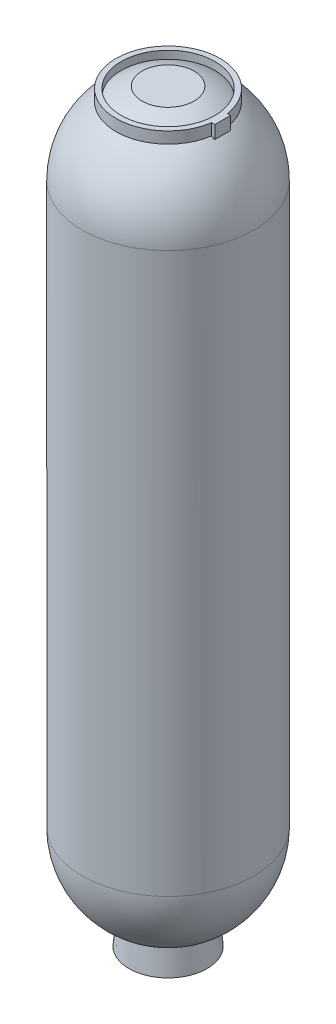
ISO-10303-21;
HEADER;
FILE_DESCRIPTION(('STEP AP214'),'2;1');
FILE_NAME('part.step','',(''),(''),'','','');
FILE_SCHEMA(('AUTOMOTIVE_DESIGN { 1 0 10303 214 1 1 1 1 }'));
ENDSEC;
DATA;
#1=APPLICATION_CONTEXT('core data for automotive mechanical design processes');
#2=APPLICATION_PROTOCOL_DEFINITION('international standard','automotive_design',2000,#1);
#3=PRODUCT_CONTEXT('',#1,'mechanical');
#4=PRODUCT('Part','Part','',(#3));
#5=PRODUCT_RELATED_PRODUCT_CATEGORY('part','',(#4));
#6=PRODUCT_DEFINITION_FORMATION('','',#4);
#7=PRODUCT_DEFINITION_CONTEXT('part definition',#1,'design');
#8=PRODUCT_DEFINITION('design','',#6,#7);
#9=PRODUCT_DEFINITION_SHAPE('','',#8);
#10=(LENGTH_UNIT() NAMED_UNIT(*) SI_UNIT(.MILLI.,.METRE.));
#11=(NAMED_UNIT(*) PLANE_ANGLE_UNIT() SI_UNIT($,.RADIAN.));
#12=(NAMED_UNIT(*) SI_UNIT($,.STERADIAN.) SOLID_ANGLE_UNIT());
#13=UNCERTAINTY_MEASURE_WITH_UNIT(LENGTH_MEASURE(1.E-05),#10,'distance_accuracy_value','');
#14=(GEOMETRIC_REPRESENTATION_CONTEXT(3) GLOBAL_UNCERTAINTY_ASSIGNED_CONTEXT((#13)) GLOBAL_UNIT_ASSIGNED_CONTEXT((#10,
#11,#12)) REPRESENTATION_CONTEXT('',''));
#15=CARTESIAN_POINT('',(0.,0.,0.));
#16=DIRECTION('',(0.,0.,1.));
#17=DIRECTION('',(1.,0.,0.));
#18=AXIS2_PLACEMENT_3D('',#15,#16,#17);
#19=CARTESIAN_POINT('',(0.,0.,0.));
#20=DIRECTION('',(0.,-1.,0.));
#21=DIRECTION('',(0.,0.,-1.));
#22=AXIS2_PLACEMENT_3D('',#19,#20,#21);
#23=CONICAL_SURFACE('',#22,15.,0.0930316682141421);
#24=CARTESIAN_POINT('',(0.,10.,0.));
#25=DIRECTION('',(0.,-1.,0.));
#26=DIRECTION('',(0.,0.,-1.));
#27=AXIS2_PLACEMENT_3D('',#24,#25,#26);
#28=CIRCLE('',#27,14.0669900636285);
#29=CARTESIAN_POINT('',(0.,10.,-14.0669900636285));
#30=VERTEX_POINT('',#29);
#31=EDGE_CURVE('E43',#30,#30,#28,.T.);
#32=ORIENTED_EDGE('',*,*,#31,.T.);
#33=EDGE_LOOP('',(#32));
#34=FACE_BOUND('',#33,.T.);
#35=CARTESIAN_POINT('',(0.,0.,0.));
#36=DIRECTION('',(0.,-1.,0.));
#37=DIRECTION('',(0.,0.,-1.));
#38=AXIS2_PLACEMENT_3D('',#35,#36,#37);
#39=CIRCLE('',#38,15.);
#40=CARTESIAN_POINT('',(0.,0.,-15.));
#41=VERTEX_POINT('',#40);
#42=EDGE_CURVE('E119',#41,#41,#39,.T.);
#43=ORIENTED_EDGE('',*,*,#42,.F.);
#44=EDGE_LOOP('',(#43));
#45=FACE_BOUND('',#44,.T.);
#46=ADVANCED_FACE('F36',(#34,#45),#23,.T.);
#47=CARTESIAN_POINT('',(0.,39.8516296129672,0.));
#48=DIRECTION('',(0.,-1.,0.));
#49=DIRECTION('',(1.,0.,0.));
#50=AXIS2_PLACEMENT_3D('',#47,#48,#49);
#51=SPHERICAL_SURFACE('',#50,33.);
#52=CARTESIAN_POINT('',(0.,39.8516296129672,0.));
#53=DIRECTION('',(0.,-1.,0.));
#54=DIRECTION('',(0.,0.,-1.));
#55=AXIS2_PLACEMENT_3D('',#52,#53,#54);
#56=CIRCLE('',#55,33.);
#57=CARTESIAN_POINT('',(0.,39.8516296129672,-33.));
#58=VERTEX_POINT('',#57);
#59=EDGE_CURVE('E144',#58,#58,#56,.T.);
#60=ORIENTED_EDGE('',*,*,#59,.T.);
#61=EDGE_LOOP('',(#60));
#62=FACE_BOUND('',#61,.T.);
#63=ORIENTED_EDGE('',*,*,#31,.F.);
#64=EDGE_LOOP('',(#63));
#65=FACE_BOUND('',#64,.T.);
#66=ADVANCED_FACE('F151',(#62,#65),#51,.T.);
#67=CARTESIAN_POINT('',(0.,0.,0.));
#68=DIRECTION('',(0.,-1.,0.));
#69=DIRECTION('',(0.,0.,-1.));
#70=AXIS2_PLACEMENT_3D('',#67,#68,#69);
#71=CYLINDRICAL_SURFACE('',#70,33.);
#72=CARTESIAN_POINT('',(0.,254.851629612967,0.));
#73=DIRECTION('',(0.,-1.,0.));
#74=DIRECTION('',(0.,0.,-1.));
#75=AXIS2_PLACEMENT_3D('',#72,#73,#74);
#76=CIRCLE('',#75,33.);
#77=CARTESIAN_POINT('',(0.,254.851629612967,-33.));
#78=VERTEX_POINT('',#77);
#79=EDGE_CURVE('E141',#78,#78,#76,.T.);
#80=ORIENTED_EDGE('',*,*,#79,.T.);
#81=EDGE_LOOP('',(#80));
#82=FACE_BOUND('',#81,.T.);
#83=ORIENTED_EDGE('',*,*,#59,.F.);
#84=EDGE_LOOP('',(#83));
#85=FACE_BOUND('',#84,.T.);
#86=ADVANCED_FACE('F153',(#82,#85),#71,.T.);
#87=CARTESIAN_POINT('',(0.,254.851629612967,0.));
#88=DIRECTION('',(0.,-1.,0.));
#89=DIRECTION('',(1.,0.,0.));
#90=AXIS2_PLACEMENT_3D('',#87,#88,#89);
#91=SPHERICAL_SURFACE('',#90,33.);
#92=CARTESIAN_POINT('',(0.,254.851629612967,-3.));
#93=DIRECTION('',(0.,0.,-1.));
#94=DIRECTION('',(-1.,0.,0.));
#95=AXIS2_PLACEMENT_3D('',#92,#93,#94);
#96=CIRCLE('',#95,32.86335345031);
#97=CARTESIAN_POINT('',(20.533741341692,280.510262984846,-3.));
#98=VERTEX_POINT('',#97);
#99=CARTESIAN_POINT('',(19.7737199332852,281.10043910978,-3.));
#100=VERTEX_POINT('',#99);
#101=EDGE_CURVE('E50',#98,#100,#96,.F.);
#102=ORIENTED_EDGE('',*,*,#101,.F.);
#103=CARTESIAN_POINT('',(0.,280.510262984846,0.));
#104=DIRECTION('',(0.,-1.,0.));
#105=DIRECTION('',(0.,0.,-1.));
#106=AXIS2_PLACEMENT_3D('',#103,#104,#105);
#107=CIRCLE('',#106,20.7517356740951);
#108=CARTESIAN_POINT('',(20.533741341692,280.510262984846,3.));
#109=VERTEX_POINT('',#108);
#110=EDGE_CURVE('E11',#109,#98,#107,.F.);
#111=ORIENTED_EDGE('',*,*,#110,.F.);
#112=CARTESIAN_POINT('',(0.,254.851629612967,3.));
#113=DIRECTION('',(0.,0.,1.));
#114=DIRECTION('',(1.,0.,0.));
#115=AXIS2_PLACEMENT_3D('',#112,#113,#114);
#116=CIRCLE('',#115,32.86335345031);
#117=CARTESIAN_POINT('',(19.7737199332852,281.10043910978,3.));
#118=VERTEX_POINT('',#117);
#119=EDGE_CURVE('E86',#118,#109,#116,.F.);
#120=ORIENTED_EDGE('',*,*,#119,.F.);
#121=CARTESIAN_POINT('',(0.,281.10043910978,0.));
#122=DIRECTION('',(0.,-1.,0.));
#123=DIRECTION('',(0.,0.,-1.));
#124=AXIS2_PLACEMENT_3D('',#121,#122,#123);
#125=CIRCLE('',#124,20.);
#126=EDGE_CURVE('E139',#118,#100,#125,.T.);
#127=ORIENTED_EDGE('',*,*,#126,.T.);
#128=EDGE_LOOP('',(#102,#111,#120,#127));
#129=FACE_BOUND('',#128,.T.);
#130=ORIENTED_EDGE('',*,*,#79,.F.);
#131=EDGE_LOOP('',(#130));
#132=FACE_BOUND('',#131,.T.);
#133=ADVANCED_FACE('F159',(#129,#132),#91,.T.);
#134=CARTESIAN_POINT('',(0.,0.,0.));
#135=DIRECTION('',(0.,-1.,0.));
#136=DIRECTION('',(0.,0.,-1.));
#137=AXIS2_PLACEMENT_3D('',#134,#135,#136);
#138=CYLINDRICAL_SURFACE('',#137,20.);
#139=DIRECTION('',(0.,-1.,0.));
#140=VECTOR('',#139,1.);
#141=CARTESIAN_POINT('',(19.7737199332852,0.,-3.));
#142=LINE('',#141,#140);
#143=CARTESIAN_POINT('',(19.7737199332852,285.510262984846,-3.));
#144=VERTEX_POINT('',#143);
#145=EDGE_CURVE('E115',#100,#144,#142,.F.);
#146=ORIENTED_EDGE('',*,*,#145,.F.);
#147=ORIENTED_EDGE('',*,*,#126,.F.);
#148=DIRECTION('',(0.,-1.,0.));
#149=VECTOR('',#148,1.);
#150=CARTESIAN_POINT('',(19.7737199332852,0.,3.));
#151=LINE('',#150,#149);
#152=CARTESIAN_POINT('',(19.7737199332852,285.510262984846,3.));
#153=VERTEX_POINT('',#152);
#154=EDGE_CURVE('E111',#153,#118,#151,.T.);
#155=ORIENTED_EDGE('',*,*,#154,.F.);
#156=CARTESIAN_POINT('',(0.,285.510262984846,0.));
#157=DIRECTION('',(0.,-1.,0.));
#158=DIRECTION('',(0.,0.,-1.));
#159=AXIS2_PLACEMENT_3D('',#156,#157,#158);
#160=CIRCLE('',#159,20.);
#161=EDGE_CURVE('E137',#153,#144,#160,.T.);
#162=ORIENTED_EDGE('',*,*,#161,.T.);
#163=EDGE_LOOP('',(#146,#147,#155,#162));
#164=FACE_BOUND('',#163,.T.);
#165=ADVANCED_FACE('F165',(#164),#138,.T.);
#166=CARTESIAN_POINT('',(18.,285.510262984846,0.));
#167=DIRECTION('',(0.,1.,0.));
#168=DIRECTION('',(0.,0.,1.));
#169=AXIS2_PLACEMENT_3D('',#166,#167,#168);
#170=PLANE('',#169);
#171=CARTESIAN_POINT('',(0.,285.510262984846,0.));
#172=DIRECTION('',(0.,-1.,0.));
#173=DIRECTION('',(0.,0.,-1.));
#174=AXIS2_PLACEMENT_3D('',#171,#172,#173);
#175=CIRCLE('',#174,18.);
#176=CARTESIAN_POINT('',(0.,285.510262984846,-18.));
#177=VERTEX_POINT('',#176);
#178=EDGE_CURVE('E134',#177,#177,#175,.T.);
#179=ORIENTED_EDGE('',*,*,#178,.T.);
#180=EDGE_LOOP('',(#179));
#181=FACE_BOUND('',#180,.T.);
#182=ORIENTED_EDGE('',*,*,#161,.F.);
#183=DIRECTION('',(1.,0.,0.));
#184=VECTOR('',#183,1.);
#185=CARTESIAN_POINT('',(21.,285.510262984846,3.));
#186=LINE('',#185,#184);
#187=CARTESIAN_POINT('',(21.,285.510262984846,3.));
#188=VERTEX_POINT('',#187);
#189=EDGE_CURVE('E106',#153,#188,#186,.T.);
#190=ORIENTED_EDGE('',*,*,#189,.T.);
#191=DIRECTION('',(0.,0.,-1.));
#192=VECTOR('',#191,1.);
#193=CARTESIAN_POINT('',(21.,285.510262984846,-3.));
#194=LINE('',#193,#192);
#195=CARTESIAN_POINT('',(21.,285.510262984846,-3.));
#196=VERTEX_POINT('',#195);
#197=EDGE_CURVE('E97',#188,#196,#194,.T.);
#198=ORIENTED_EDGE('',*,*,#197,.T.);
#199=DIRECTION('',(-1.,0.,0.));
#200=VECTOR('',#199,1.);
#201=CARTESIAN_POINT('',(18.,285.510262984846,-3.));
#202=LINE('',#201,#200);
#203=EDGE_CURVE('E90',#196,#144,#202,.T.);
#204=ORIENTED_EDGE('',*,*,#203,.T.);
#205=EDGE_LOOP('',(#182,#190,#198,#204));
#206=FACE_BOUND('',#205,.T.);
#207=ADVANCED_FACE('F168',(#181,#206),#170,.T.);
#208=CARTESIAN_POINT('',(0.,0.,0.));
#209=DIRECTION('',(0.,-1.,0.));
#210=DIRECTION('',(0.,0.,-1.));
#211=AXIS2_PLACEMENT_3D('',#208,#209,#210);
#212=CYLINDRICAL_SURFACE('',#211,18.);
#213=CARTESIAN_POINT('',(0.,282.510262984846,0.));
#214=DIRECTION('',(0.,-1.,0.));
#215=DIRECTION('',(0.,0.,-1.));
#216=AXIS2_PLACEMENT_3D('',#213,#214,#215);
#217=CIRCLE('',#216,18.);
#218=CARTESIAN_POINT('',(18.,282.510262984846,0.));
#219=VERTEX_POINT('',#218);
#220=EDGE_CURVE('E131',#219,#219,#217,.T.);
#221=ORIENTED_EDGE('',*,*,#220,.T.);
#222=EDGE_LOOP('',(#221));
#223=FACE_BOUND('',#222,.T.);
#224=ORIENTED_EDGE('',*,*,#178,.F.);
#225=EDGE_LOOP('',(#224));
#226=FACE_BOUND('',#225,.T.);
#227=ADVANCED_FACE('F172',(#223,#226),#212,.F.);
#228=CARTESIAN_POINT('',(0.,254.851629612967,0.));
#229=DIRECTION('',(0.,-1.,0.));
#230=DIRECTION('',(1.,0.,0.));
#231=AXIS2_PLACEMENT_3D('',#228,#229,#230);
#232=SPHERICAL_SURFACE('',#231,33.);
#233=CARTESIAN_POINT('',(0.,286.3,0.));
#234=DIRECTION('',(0.,-1.,0.));
#235=DIRECTION('',(0.,0.,-1.));
#236=AXIS2_PLACEMENT_3D('',#233,#234,#235);
#237=CIRCLE('',#236,10.);
#238=CARTESIAN_POINT('',(9.99999999999979,286.3,0.));
#239=VERTEX_POINT('',#238);
#240=EDGE_CURVE('E128',#239,#239,#237,.T.);
#241=CARTESIAN_POINT('',(9.99999999999979,286.3,0.));
#242=CARTESIAN_POINT('',(10.0881407690275,286.271972876379,0.));
#243=CARTESIAN_POINT('',(10.1761637040151,286.243575184379,0.));
#244=CARTESIAN_POINT('',(10.3519676964919,286.186040712444,0.));
#245=CARTESIAN_POINT('',(10.4397487539811,286.156903932509,0.));
#246=CARTESIAN_POINT('',(10.6150627820426,286.097893333529,0.));
#247=CARTESIAN_POINT('',(10.7025957526149,286.068019514483,0.));
#248=CARTESIAN_POINT('',(10.8774074195451,286.00753695221,0.));
#249=CARTESIAN_POINT('',(10.964686115903,285.976928208984,0.));
#250=CARTESIAN_POINT('',(11.1389830638551,285.914977961484,0.));
#251=CARTESIAN_POINT('',(11.2260013154494,285.883636457212,0.));
#252=CARTESIAN_POINT('',(11.3997712220668,285.820222903565,0.));
#253=CARTESIAN_POINT('',(11.4865228770899,285.78815085419,0.));
#254=CARTESIAN_POINT('',(11.6597534575166,285.723278477661,0.));
#255=CARTESIAN_POINT('',(11.7462323829202,285.690478150507,0.));
#256=CARTESIAN_POINT('',(11.9189113903642,285.624151537298,0.));
#257=CARTESIAN_POINT('',(12.0051114724045,285.590625251243,0.));
#258=CARTESIAN_POINT('',(12.1772266990852,285.522849090417,0.));
#259=CARTESIAN_POINT('',(12.2631418437255,285.488599215646,0.));
#260=CARTESIAN_POINT('',(12.4346811217149,285.419378298732,0.));
#261=CARTESIAN_POINT('',(12.5203052550641,285.384407256588,0.));
#262=CARTESIAN_POINT('',(12.6912564571532,285.313746477256,0.));
#263=CARTESIAN_POINT('',(12.7765835258931,285.278056740067,0.));
#264=CARTESIAN_POINT('',(12.9469345664472,285.205961093778,0.));
#265=CARTESIAN_POINT('',(13.0319585382613,285.169555184679,0.));
#266=CARTESIAN_POINT('',(13.2016973740751,285.096029768337,0.));
#267=CARTESIAN_POINT('',(13.2864122380747,285.058910261095,0.));
#268=CARTESIAN_POINT('',(13.4555268692234,284.983960272682,0.));
#269=CARTESIAN_POINT('',(13.5399266363726,284.946129791512,0.));
#270=CARTESIAN_POINT('',(13.7084051070608,284.869760529723,0.));
#271=CARTESIAN_POINT('',(13.7924838105998,284.831221749105,0.));
#272=CARTESIAN_POINT('',(13.960314210006,284.753438612971,0.));
#273=CARTESIAN_POINT('',(14.0440659058732,284.714194257456,0.));
#274=CARTESIAN_POINT('',(14.2112363689923,284.635002745966,0.));
#275=CARTESIAN_POINT('',(14.2946551362443,284.59505558999,0.));
#276=CARTESIAN_POINT('',(14.4611538447265,284.514461301698,0.));
#277=CARTESIAN_POINT('',(14.5442337859567,284.473814169381,0.));
#278=CARTESIAN_POINT('',(14.7100489689426,284.391822802013,0.));
#279=CARTESIAN_POINT('',(14.7927842106982,284.350478566961,0.));
#280=CARTESIAN_POINT('',(14.9579041456513,284.267095917011,0.));
#281=CARTESIAN_POINT('',(15.0402888388487,284.225057502112,0.));
#282=CARTESIAN_POINT('',(15.204701852384,284.140289464434,0.));
#283=CARTESIAN_POINT('',(15.2867301727219,284.097559841654,0.));
#284=CARTESIAN_POINT('',(15.4504246414312,284.011412409042,0.));
#285=CARTESIAN_POINT('',(15.5320907898026,283.96799459921,0.));
#286=CARTESIAN_POINT('',(15.6950551410763,283.880473861979,0.));
#287=CARTESIAN_POINT('',(15.7763533439785,283.836370934579,0.));
#288=CARTESIAN_POINT('',(15.9385760568236,283.747483080129,0.));
#289=CARTESIAN_POINT('',(16.0195005667666,283.702698153078,0.));
#290=CARTESIAN_POINT('',(16.1809701726209,283.61244946546,0.));
#291=CARTESIAN_POINT('',(16.2615152685323,283.566985704892,0.));
#292=CARTESIAN_POINT('',(16.4222203520778,283.475382564365,0.));
#293=CARTESIAN_POINT('',(16.5023803397117,283.429243184407,0.));
#294=CARTESIAN_POINT('',(16.662309539671,283.336292066975,0.));
#295=CARTESIAN_POINT('',(16.7420787519962,283.289480329501,0.));
#296=CARTESIAN_POINT('',(16.9012207619742,283.195187806509,0.));
#297=CARTESIAN_POINT('',(16.9805935596269,283.147707020992,0.));
#298=CARTESIAN_POINT('',(17.1389371287684,283.052079758445,0.));
#299=CARTESIAN_POINT('',(17.2179079002571,283.003933281416,0.));
#300=CARTESIAN_POINT('',(17.3754418345704,282.906978040331,0.));
#301=CARTESIAN_POINT('',(17.454004997395,282.858169276276,0.));
#302=CARTESIAN_POINT('',(17.6107181585712,282.75989290912,0.));
#303=CARTESIAN_POINT('',(17.6888681569228,282.71042530602,0.));
#304=CARTESIAN_POINT('',(17.8447494704846,282.610834767745,0.));
#305=CARTESIAN_POINT('',(17.9224807856948,282.560711832571,0.));
#306=CARTESIAN_POINT('',(18.,282.510262984846,0.));
#307=B_SPLINE_CURVE_WITH_KNOTS('',3,(#241,#242,#243,#244,#245,#246,#247,#248,#249,#250,#251,
#252,#253,#254,#255,#256,#257,#258,#259,#260,#261,#262,#263,#264,#265,#266,#267,#268,#269,#270,
#271,#272,#273,#274,#275,#276,#277,#278,#279,#280,#281,#282,#283,#284,#285,#286,#287,#288,#289,
#290,#291,#292,#293,#294,#295,#296,#297,#298,#299,#300,#301,#302,#303,#304,#305,#306),
.UNSPECIFIED.,.F.,.F.,(4,2,2,2,2,2,2,2,2,2,2,2,2,2,2,2,2,2,2,2,2,2,2,2,2,2,2,2,2,2,2,2,4),(0.,
0.27746779940082,0.554935598801655,0.832403398202498,1.10987119760334,1.38733899700416,
1.66480679640502,1.94227459580584,2.21974239520668,2.49721019460752,2.77467799400837,
3.0521457934092,3.32961359281003,3.60708139221087,3.88454919161171,4.16201699101254,
4.43948479041338,4.71695258981421,4.99442038921504,5.27188818861589,5.54935598801671,
5.82682378741756,6.1042915868184,6.38175938621924,6.65922718562007,6.93669498502091,
7.21416278442175,7.49163058382257,7.76909838322341,8.04656618262425,8.32403398202509,
8.60150178142591,8.87896958082677),.UNSPECIFIED.);
#308=EDGE_CURVE('BSEAM176',#239,#219,#307,.T.);
#309=ORIENTED_EDGE('',*,*,#240,.T.);
#310=ORIENTED_EDGE('',*,*,#220,.F.);
#311=ORIENTED_EDGE('',*,*,#308,.T.);
#312=ORIENTED_EDGE('',*,*,#308,.F.);
#313=EDGE_LOOP('',(#309,#311,#310,#312));
#314=FACE_BOUND('',#313,.T.);
#315=ADVANCED_FACE('F176',(#314),#232,.T.);
#316=CARTESIAN_POINT('',(10.,286.3,0.));
#317=DIRECTION('',(0.,1.,0.));
#318=DIRECTION('',(0.,0.,1.));
#319=AXIS2_PLACEMENT_3D('',#316,#317,#318);
#320=PLANE('',#319);
#321=ORIENTED_EDGE('',*,*,#240,.F.);
#322=EDGE_LOOP('',(#321));
#323=FACE_BOUND('',#322,.T.);
#324=ADVANCED_FACE('F180',(#323),#320,.T.);
#325=CARTESIAN_POINT('',(6.00000000000003,10.,0.));
#326=DIRECTION('',(0.,-1.,0.));
#327=DIRECTION('',(0.,0.,-1.));
#328=AXIS2_PLACEMENT_3D('',#325,#326,#327);
#329=PLANE('',#328);
#330=CARTESIAN_POINT('',(0.,10.,0.));
#331=DIRECTION('',(0.,-1.,0.));
#332=DIRECTION('',(0.,0.,-1.));
#333=AXIS2_PLACEMENT_3D('',#330,#331,#332);
#334=CIRCLE('',#333,6.00000000000003);
#335=CARTESIAN_POINT('',(0.,10.,-6.00000000000003));
#336=VERTEX_POINT('',#335);
#337=EDGE_CURVE('E125',#336,#336,#334,.T.);
#338=ORIENTED_EDGE('',*,*,#337,.T.);
#339=EDGE_LOOP('',(#338));
#340=FACE_BOUND('',#339,.T.);
#341=ADVANCED_FACE('F184',(#340),#329,.T.);
#342=CARTESIAN_POINT('',(0.,10.,0.));
#343=DIRECTION('',(0.,-1.,0.));
#344=DIRECTION('',(0.,0.,-1.));
#345=AXIS2_PLACEMENT_3D('',#342,#343,#344);
#346=CONICAL_SURFACE('',#345,6.00000000000003,0.610725964389206);
#347=CARTESIAN_POINT('',(0.,0.,0.));
#348=DIRECTION('',(0.,-1.,0.));
#349=DIRECTION('',(0.,0.,-1.));
#350=AXIS2_PLACEMENT_3D('',#347,#348,#349);
#351=CIRCLE('',#350,13.);
#352=CARTESIAN_POINT('',(0.,0.,-13.));
#353=VERTEX_POINT('',#352);
#354=EDGE_CURVE('E122',#353,#353,#351,.T.);
#355=ORIENTED_EDGE('',*,*,#354,.T.);
#356=EDGE_LOOP('',(#355));
#357=FACE_BOUND('',#356,.T.);
#358=ORIENTED_EDGE('',*,*,#337,.F.);
#359=EDGE_LOOP('',(#358));
#360=FACE_BOUND('',#359,.T.);
#361=ADVANCED_FACE('F188',(#357,#360),#346,.F.);
#362=CARTESIAN_POINT('',(15.,0.,0.));
#363=DIRECTION('',(0.,-1.,0.));
#364=DIRECTION('',(0.,0.,-1.));
#365=AXIS2_PLACEMENT_3D('',#362,#363,#364);
#366=PLANE('',#365);
#367=ORIENTED_EDGE('',*,*,#42,.T.);
#368=EDGE_LOOP('',(#367));
#369=FACE_BOUND('',#368,.T.);
#370=ORIENTED_EDGE('',*,*,#354,.F.);
#371=EDGE_LOOP('',(#370));
#372=FACE_BOUND('',#371,.T.);
#373=ADVANCED_FACE('F192',(#369,#372),#366,.T.);
#374=CARTESIAN_POINT('',(18.,280.510262984846,-3.));
#375=DIRECTION('',(0.,0.,-1.));
#376=DIRECTION('',(-1.,0.,0.));
#377=AXIS2_PLACEMENT_3D('',#374,#375,#376);
#378=PLANE('',#377);
#379=DIRECTION('',(-1.,0.,0.));
#380=VECTOR('',#379,1.);
#381=CARTESIAN_POINT('',(18.,280.510262984846,-3.));
#382=LINE('',#381,#380);
#383=CARTESIAN_POINT('',(21.,280.510262984846,-3.));
#384=VERTEX_POINT('',#383);
#385=EDGE_CURVE('E99',#384,#98,#382,.T.);
#386=ORIENTED_EDGE('',*,*,#385,.T.);
#387=ORIENTED_EDGE('',*,*,#101,.T.);
#388=ORIENTED_EDGE('',*,*,#145,.T.);
#389=ORIENTED_EDGE('',*,*,#203,.F.);
#390=DIRECTION('',(0.,1.,0.));
#391=VECTOR('',#390,1.);
#392=CARTESIAN_POINT('',(21.,280.510262984846,-3.));
#393=LINE('',#392,#391);
#394=EDGE_CURVE('E98',#384,#196,#393,.T.);
#395=ORIENTED_EDGE('',*,*,#394,.F.);
#396=EDGE_LOOP('',(#386,#387,#388,#389,#395));
#397=FACE_BOUND('',#396,.T.);
#398=ADVANCED_FACE('F196',(#397),#378,.T.);
#399=CARTESIAN_POINT('',(21.,280.510262984846,-3.));
#400=DIRECTION('',(1.,0.,0.));
#401=DIRECTION('',(0.,0.,-1.));
#402=AXIS2_PLACEMENT_3D('',#399,#400,#401);
#403=PLANE('',#402);
#404=ORIENTED_EDGE('',*,*,#197,.F.);
#405=DIRECTION('',(0.,1.,0.));
#406=VECTOR('',#405,1.);
#407=CARTESIAN_POINT('',(21.,280.510262984846,3.));
#408=LINE('',#407,#406);
#409=CARTESIAN_POINT('',(21.,280.510262984846,3.));
#410=VERTEX_POINT('',#409);
#411=EDGE_CURVE('E84',#410,#188,#408,.T.);
#412=ORIENTED_EDGE('',*,*,#411,.F.);
#413=DIRECTION('',(0.,0.,-1.));
#414=VECTOR('',#413,1.);
#415=CARTESIAN_POINT('',(21.,280.510262984846,-3.));
#416=LINE('',#415,#414);
#417=EDGE_CURVE('E89',#410,#384,#416,.T.);
#418=ORIENTED_EDGE('',*,*,#417,.T.);
#419=ORIENTED_EDGE('',*,*,#394,.T.);
#420=EDGE_LOOP('',(#404,#412,#418,#419));
#421=FACE_BOUND('',#420,.T.);
#422=ADVANCED_FACE('F94',(#421),#403,.T.);
#423=CARTESIAN_POINT('',(21.,280.510262984846,3.));
#424=DIRECTION('',(0.,0.,1.));
#425=DIRECTION('',(1.,0.,0.));
#426=AXIS2_PLACEMENT_3D('',#423,#424,#425);
#427=PLANE('',#426);
#428=ORIENTED_EDGE('',*,*,#154,.T.);
#429=ORIENTED_EDGE('',*,*,#119,.T.);
#430=DIRECTION('',(1.,0.,0.));
#431=VECTOR('',#430,1.);
#432=CARTESIAN_POINT('',(21.,280.510262984846,3.));
#433=LINE('',#432,#431);
#434=EDGE_CURVE('E79',#109,#410,#433,.T.);
#435=ORIENTED_EDGE('',*,*,#434,.T.);
#436=ORIENTED_EDGE('',*,*,#411,.T.);
#437=ORIENTED_EDGE('',*,*,#189,.F.);
#438=EDGE_LOOP('',(#428,#429,#435,#436,#437));
#439=FACE_BOUND('',#438,.T.);
#440=ADVANCED_FACE('F82',(#439),#427,.T.);
#441=CARTESIAN_POINT('',(0.,280.510262984846,0.));
#442=DIRECTION('',(0.,-1.,0.));
#443=DIRECTION('',(0.,0.,-1.));
#444=AXIS2_PLACEMENT_3D('',#441,#442,#443);
#445=PLANE('',#444);
#446=ORIENTED_EDGE('',*,*,#434,.F.);
#447=ORIENTED_EDGE('',*,*,#110,.T.);
#448=ORIENTED_EDGE('',*,*,#385,.F.);
#449=ORIENTED_EDGE('',*,*,#417,.F.);
#450=EDGE_LOOP('',(#446,#447,#448,#449));
#451=FACE_BOUND('',#450,.T.);
#452=ADVANCED_FACE('F101',(#451),#445,.T.);
#453=CLOSED_SHELL('',(#46,#66,#86,#133,#165,#207,#227,#315,#324,#341,#361,#373,#398,#422,#440,#452));
#454=MANIFOLD_SOLID_BREP('B2',#453);
#455=ADVANCED_BREP_SHAPE_REPRESENTATION('',(#18,#454),#14);
#456=SHAPE_DEFINITION_REPRESENTATION(#9,#455);
ENDSEC;
END-ISO-10303-21;
